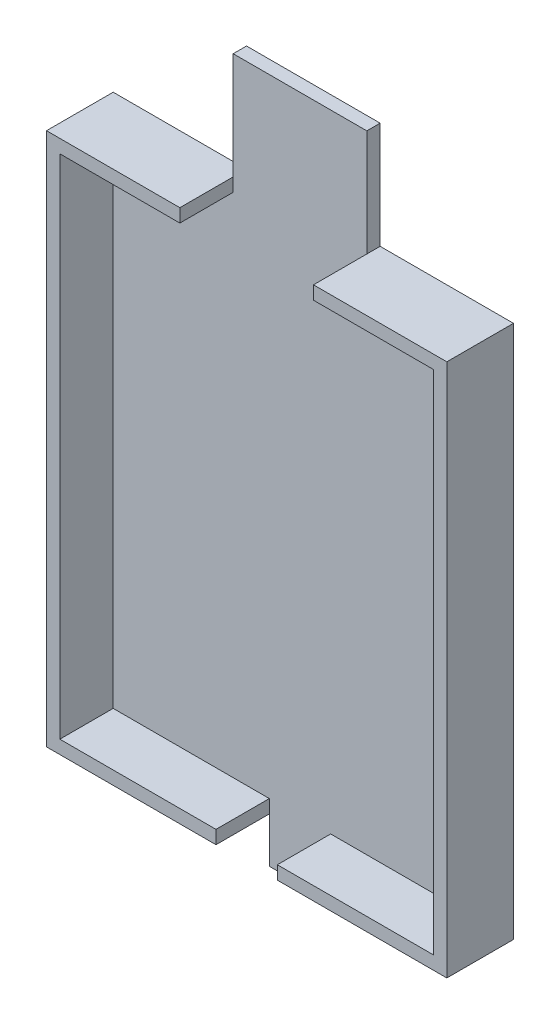
ISO-10303-21;
HEADER;
FILE_DESCRIPTION(('STEP AP214'),'2;1');
FILE_NAME('part.step','',(''),(''),'','','');
FILE_SCHEMA(('AUTOMOTIVE_DESIGN { 1 0 10303 214 1 1 1 1 }'));
ENDSEC;
DATA;
#1=APPLICATION_CONTEXT('core data for automotive mechanical design processes');
#2=APPLICATION_PROTOCOL_DEFINITION('international standard','automotive_design',2000,#1);
#3=PRODUCT_CONTEXT('',#1,'mechanical');
#4=PRODUCT('Part','Part','',(#3));
#5=PRODUCT_RELATED_PRODUCT_CATEGORY('part','',(#4));
#6=PRODUCT_DEFINITION_FORMATION('','',#4);
#7=PRODUCT_DEFINITION_CONTEXT('part definition',#1,'design');
#8=PRODUCT_DEFINITION('design','',#6,#7);
#9=PRODUCT_DEFINITION_SHAPE('','',#8);
#10=(LENGTH_UNIT() NAMED_UNIT(*) SI_UNIT(.MILLI.,.METRE.));
#11=(NAMED_UNIT(*) PLANE_ANGLE_UNIT() SI_UNIT($,.RADIAN.));
#12=(NAMED_UNIT(*) SI_UNIT($,.STERADIAN.) SOLID_ANGLE_UNIT());
#13=UNCERTAINTY_MEASURE_WITH_UNIT(LENGTH_MEASURE(1.E-05),#10,'distance_accuracy_value','');
#14=(GEOMETRIC_REPRESENTATION_CONTEXT(3) GLOBAL_UNCERTAINTY_ASSIGNED_CONTEXT((#13)) GLOBAL_UNIT_ASSIGNED_CONTEXT((#10,
#11,#12)) REPRESENTATION_CONTEXT('',''));
#15=CARTESIAN_POINT('',(0.,0.,0.));
#16=DIRECTION('',(0.,0.,1.));
#17=DIRECTION('',(1.,0.,0.));
#18=AXIS2_PLACEMENT_3D('',#15,#16,#17);
#19=CARTESIAN_POINT('',(0.,0.,5.));
#20=DIRECTION('',(0.,0.,1.));
#21=DIRECTION('',(1.,0.,0.));
#22=AXIS2_PLACEMENT_3D('',#19,#20,#21);
#23=PLANE('',#22);
#24=DIRECTION('',(1.,0.,0.));
#25=VECTOR('',#24,1.);
#26=CARTESIAN_POINT('',(71.8364077669903,146.449514563107,5.));
#27=LINE('',#26,#25);
#28=CARTESIAN_POINT('',(26.8364077669903,146.449514563107,5.));
#29=VERTEX_POINT('',#28);
#30=CARTESIAN_POINT('',(71.8364077669903,146.449514563107,5.));
#31=VERTEX_POINT('',#30);
#32=EDGE_CURVE('E61',#29,#31,#27,.T.);
#33=ORIENTED_EDGE('',*,*,#32,.F.);
#34=DIRECTION('',(0.,-1.,0.));
#35=VECTOR('',#34,1.);
#36=CARTESIAN_POINT('',(26.8364077669903,146.449514563107,5.));
#37=LINE('',#36,#35);
#38=CARTESIAN_POINT('',(26.8364077669903,151.449514563107,5.));
#39=VERTEX_POINT('',#38);
#40=EDGE_CURVE('E219',#39,#29,#37,.T.);
#41=ORIENTED_EDGE('',*,*,#40,.F.);
#42=DIRECTION('',(0.,1.,0.));
#43=VECTOR('',#42,1.);
#44=CARTESIAN_POINT('',(26.8364077669902,191.449514563107,5.));
#45=LINE('',#44,#43);
#46=CARTESIAN_POINT('',(26.8364077669902,191.449514563107,5.));
#47=VERTEX_POINT('',#46);
#48=EDGE_CURVE('E310',#39,#47,#45,.T.);
#49=ORIENTED_EDGE('',*,*,#48,.T.);
#50=DIRECTION('',(-1.,0.,0.));
#51=VECTOR('',#50,1.);
#52=CARTESIAN_POINT('',(-23.2635922330097,191.449514563107,5.));
#53=LINE('',#52,#51);
#54=CARTESIAN_POINT('',(-23.2635922330097,191.449514563107,5.));
#55=VERTEX_POINT('',#54);
#56=EDGE_CURVE('E313',#47,#55,#53,.T.);
#57=ORIENTED_EDGE('',*,*,#56,.T.);
#58=DIRECTION('',(0.,-1.,0.));
#59=VECTOR('',#58,1.);
#60=CARTESIAN_POINT('',(-23.2635922330097,151.449514563107,5.));
#61=LINE('',#60,#59);
#62=CARTESIAN_POINT('',(-23.2635922330097,151.449514563107,5.));
#63=VERTEX_POINT('',#62);
#64=EDGE_CURVE('E316',#55,#63,#61,.T.);
#65=ORIENTED_EDGE('',*,*,#64,.T.);
#66=DIRECTION('',(0.,1.,0.));
#67=VECTOR('',#66,1.);
#68=CARTESIAN_POINT('',(-23.2635922330097,146.449514563107,5.));
#69=LINE('',#68,#67);
#70=CARTESIAN_POINT('',(-23.2635922330097,146.449514563107,5.));
#71=VERTEX_POINT('',#70);
#72=EDGE_CURVE('E221',#71,#63,#69,.T.);
#73=ORIENTED_EDGE('',*,*,#72,.F.);
#74=DIRECTION('',(1.,0.,0.));
#75=VECTOR('',#74,1.);
#76=CARTESIAN_POINT('',(-68.2635922330097,146.449514563107,5.));
#77=LINE('',#76,#75);
#78=CARTESIAN_POINT('',(-68.2635922330097,146.449514563107,5.));
#79=VERTEX_POINT('',#78);
#80=EDGE_CURVE('E237',#79,#71,#77,.T.);
#81=ORIENTED_EDGE('',*,*,#80,.F.);
#82=DIRECTION('',(0.,1.,0.));
#83=VECTOR('',#82,1.);
#84=CARTESIAN_POINT('',(-68.2635922330097,-43.6504854368932,5.));
#85=LINE('',#84,#83);
#86=CARTESIAN_POINT('',(-68.2635922330097,-43.6504854368932,5.));
#87=VERTEX_POINT('',#86);
#88=EDGE_CURVE('E268',#87,#79,#85,.T.);
#89=ORIENTED_EDGE('',*,*,#88,.F.);
#90=DIRECTION('',(-1.,0.,0.));
#91=VECTOR('',#90,1.);
#92=CARTESIAN_POINT('',(-9.71359223300971,-43.6504854368932,5.));
#93=LINE('',#92,#91);
#94=CARTESIAN_POINT('',(-9.71359223300971,-43.6504854368932,5.));
#95=VERTEX_POINT('',#94);
#96=EDGE_CURVE('E264',#95,#87,#93,.T.);
#97=ORIENTED_EDGE('',*,*,#96,.F.);
#98=DIRECTION('',(0.,1.,0.));
#99=VECTOR('',#98,1.);
#100=CARTESIAN_POINT('',(-9.71359223300971,-48.6504854368932,5.));
#101=LINE('',#100,#99);
#102=CARTESIAN_POINT('',(-9.71359223300971,-48.6504854368932,5.));
#103=VERTEX_POINT('',#102);
#104=EDGE_CURVE('E226',#103,#95,#101,.T.);
#105=ORIENTED_EDGE('',*,*,#104,.F.);
#106=DIRECTION('',(0.,-1.,0.));
#107=VECTOR('',#106,1.);
#108=CARTESIAN_POINT('',(-9.71359223300971,-48.6504854368932,5.));
#109=LINE('',#108,#107);
#110=CARTESIAN_POINT('',(-9.71359223300971,-65.6504854368931,5.));
#111=VERTEX_POINT('',#110);
#112=EDGE_CURVE('E299',#103,#111,#109,.T.);
#113=ORIENTED_EDGE('',*,*,#112,.T.);
#114=DIRECTION('',(1.,0.,0.));
#115=VECTOR('',#114,1.);
#116=CARTESIAN_POINT('',(-9.71359223300971,-65.6504854368931,5.));
#117=LINE('',#116,#115);
#118=CARTESIAN_POINT('',(13.2864077669903,-65.6504854368931,5.));
#119=VERTEX_POINT('',#118);
#120=EDGE_CURVE('E303',#111,#119,#117,.T.);
#121=ORIENTED_EDGE('',*,*,#120,.T.);
#122=DIRECTION('',(0.,1.,0.));
#123=VECTOR('',#122,1.);
#124=CARTESIAN_POINT('',(13.2864077669903,-65.6504854368931,5.));
#125=LINE('',#124,#123);
#126=CARTESIAN_POINT('',(13.2864077669903,-48.6504854368932,5.));
#127=VERTEX_POINT('',#126);
#128=EDGE_CURVE('E307',#119,#127,#125,.T.);
#129=ORIENTED_EDGE('',*,*,#128,.T.);
#130=DIRECTION('',(0.,-1.,0.));
#131=VECTOR('',#130,1.);
#132=CARTESIAN_POINT('',(13.2864077669903,-48.6504854368932,5.));
#133=LINE('',#132,#131);
#134=CARTESIAN_POINT('',(13.2864077669903,-43.6504854368932,5.));
#135=VERTEX_POINT('',#134);
#136=EDGE_CURVE('E216',#135,#127,#133,.T.);
#137=ORIENTED_EDGE('',*,*,#136,.F.);
#138=DIRECTION('',(-1.,0.,0.));
#139=VECTOR('',#138,1.);
#140=CARTESIAN_POINT('',(13.2864077669903,-43.6504854368932,5.));
#141=LINE('',#140,#139);
#142=CARTESIAN_POINT('',(71.8364077669903,-43.6504854368932,5.));
#143=VERTEX_POINT('',#142);
#144=EDGE_CURVE('E434',#143,#135,#141,.T.);
#145=ORIENTED_EDGE('',*,*,#144,.F.);
#146=DIRECTION('',(0.,-1.,0.));
#147=VECTOR('',#146,1.);
#148=CARTESIAN_POINT('',(71.8364077669903,-43.6504854368932,5.));
#149=LINE('',#148,#147);
#150=EDGE_CURVE('E66',#31,#143,#149,.T.);
#151=ORIENTED_EDGE('',*,*,#150,.F.);
#152=EDGE_LOOP('',(#33,#41,#49,#57,#65,#73,#81,#89,#97,#105,#113,#121,#129,#137,#145,#151));
#153=FACE_BOUND('',#152,.T.);
#154=ADVANCED_FACE('F45',(#153),#23,.T.);
#155=CARTESIAN_POINT('',(-9.71359223300971,-48.6504854368932,5.));
#156=DIRECTION('',(1.,0.,0.));
#157=DIRECTION('',(0.,1.,0.));
#158=AXIS2_PLACEMENT_3D('',#155,#156,#157);
#159=PLANE('',#158);
#160=DIRECTION('',(0.,-1.,0.));
#161=VECTOR('',#160,1.);
#162=CARTESIAN_POINT('',(-9.71359223300971,-48.6504854368932,0.));
#163=LINE('',#162,#161);
#164=CARTESIAN_POINT('',(-9.71359223300971,-48.6504854368932,0.));
#165=VERTEX_POINT('',#164);
#166=CARTESIAN_POINT('',(-9.71359223300971,-65.6504854368931,0.));
#167=VERTEX_POINT('',#166);
#168=EDGE_CURVE('E298',#165,#167,#163,.T.);
#169=ORIENTED_EDGE('',*,*,#168,.T.);
#170=DIRECTION('',(0.,0.,-1.));
#171=VECTOR('',#170,1.);
#172=CARTESIAN_POINT('',(-9.71359223300971,-65.6504854368931,5.));
#173=LINE('',#172,#171);
#174=EDGE_CURVE('E11',#111,#167,#173,.T.);
#175=ORIENTED_EDGE('',*,*,#174,.F.);
#176=ORIENTED_EDGE('',*,*,#112,.F.);
#177=DIRECTION('',(0.,0.,-1.));
#178=VECTOR('',#177,1.);
#179=CARTESIAN_POINT('',(-9.71359223300971,-48.6504854368932,5.));
#180=LINE('',#179,#178);
#181=EDGE_CURVE('E319',#103,#165,#180,.T.);
#182=ORIENTED_EDGE('',*,*,#181,.T.);
#183=EDGE_LOOP('',(#169,#175,#176,#182));
#184=FACE_BOUND('',#183,.T.);
#185=ADVANCED_FACE('F47',(#184),#159,.F.);
#186=CARTESIAN_POINT('',(-9.71359223300971,-65.6504854368931,5.));
#187=DIRECTION('',(0.,1.,0.));
#188=DIRECTION('',(0.,0.,1.));
#189=AXIS2_PLACEMENT_3D('',#186,#187,#188);
#190=PLANE('',#189);
#191=DIRECTION('',(1.,0.,0.));
#192=VECTOR('',#191,1.);
#193=CARTESIAN_POINT('',(-9.71359223300971,-65.6504854368931,0.));
#194=LINE('',#193,#192);
#195=CARTESIAN_POINT('',(13.2864077669903,-65.6504854368931,0.));
#196=VERTEX_POINT('',#195);
#197=EDGE_CURVE('E323',#167,#196,#194,.T.);
#198=ORIENTED_EDGE('',*,*,#197,.T.);
#199=DIRECTION('',(0.,0.,-1.));
#200=VECTOR('',#199,1.);
#201=CARTESIAN_POINT('',(13.2864077669903,-65.6504854368931,5.));
#202=LINE('',#201,#200);
#203=EDGE_CURVE('E54',#119,#196,#202,.T.);
#204=ORIENTED_EDGE('',*,*,#203,.F.);
#205=ORIENTED_EDGE('',*,*,#120,.F.);
#206=ORIENTED_EDGE('',*,*,#174,.T.);
#207=EDGE_LOOP('',(#198,#204,#205,#206));
#208=FACE_BOUND('',#207,.T.);
#209=ADVANCED_FACE('F470',(#208),#190,.F.);
#210=CARTESIAN_POINT('',(13.2864077669903,-65.6504854368931,5.));
#211=DIRECTION('',(-1.,0.,0.));
#212=DIRECTION('',(0.,0.,1.));
#213=AXIS2_PLACEMENT_3D('',#210,#211,#212);
#214=PLANE('',#213);
#215=DIRECTION('',(0.,1.,0.));
#216=VECTOR('',#215,1.);
#217=CARTESIAN_POINT('',(13.2864077669903,-65.6504854368931,0.));
#218=LINE('',#217,#216);
#219=CARTESIAN_POINT('',(13.2864077669903,-48.6504854368932,0.));
#220=VERTEX_POINT('',#219);
#221=EDGE_CURVE('E326',#196,#220,#218,.T.);
#222=ORIENTED_EDGE('',*,*,#221,.T.);
#223=DIRECTION('',(0.,0.,-1.));
#224=VECTOR('',#223,1.);
#225=CARTESIAN_POINT('',(13.2864077669903,-48.6504854368932,5.));
#226=LINE('',#225,#224);
#227=EDGE_CURVE('E390',#127,#220,#226,.T.);
#228=ORIENTED_EDGE('',*,*,#227,.F.);
#229=ORIENTED_EDGE('',*,*,#128,.F.);
#230=ORIENTED_EDGE('',*,*,#203,.T.);
#231=EDGE_LOOP('',(#222,#228,#229,#230));
#232=FACE_BOUND('',#231,.T.);
#233=ADVANCED_FACE('F399',(#232),#214,.F.);
#234=CARTESIAN_POINT('',(13.2864077669903,-48.6504854368932,5.));
#235=DIRECTION('',(0.,1.,0.));
#236=DIRECTION('',(0.,0.,1.));
#237=AXIS2_PLACEMENT_3D('',#234,#235,#236);
#238=PLANE('',#237);
#239=DIRECTION('',(1.,0.,0.));
#240=VECTOR('',#239,1.);
#241=CARTESIAN_POINT('',(13.2864077669903,-48.6504854368932,0.));
#242=LINE('',#241,#240);
#243=CARTESIAN_POINT('',(76.8364077669903,-48.6504854368932,0.));
#244=VERTEX_POINT('',#243);
#245=EDGE_CURVE('E329',#220,#244,#242,.T.);
#246=ORIENTED_EDGE('',*,*,#245,.T.);
#247=DIRECTION('',(0.,0.,-1.));
#248=VECTOR('',#247,1.);
#249=CARTESIAN_POINT('',(76.8364077669903,-48.6504854368932,5.));
#250=LINE('',#249,#248);
#251=CARTESIAN_POINT('',(76.8364077669903,-48.6504854368932,25.));
#252=VERTEX_POINT('',#251);
#253=EDGE_CURVE('E386',#252,#244,#250,.T.);
#254=ORIENTED_EDGE('',*,*,#253,.F.);
#255=DIRECTION('',(1.,0.,0.));
#256=VECTOR('',#255,1.);
#257=CARTESIAN_POINT('',(76.8364077669903,-48.6504854368932,25.));
#258=LINE('',#257,#256);
#259=CARTESIAN_POINT('',(13.2864077669903,-48.6504854368932,25.));
#260=VERTEX_POINT('',#259);
#261=EDGE_CURVE('E418',#260,#252,#258,.T.);
#262=ORIENTED_EDGE('',*,*,#261,.F.);
#263=DIRECTION('',(0.,0.,-1.));
#264=VECTOR('',#263,1.);
#265=CARTESIAN_POINT('',(13.2864077669903,-48.6504854368932,25.));
#266=LINE('',#265,#264);
#267=EDGE_CURVE('E443',#260,#127,#266,.T.);
#268=ORIENTED_EDGE('',*,*,#267,.T.);
#269=ORIENTED_EDGE('',*,*,#227,.T.);
#270=EDGE_LOOP('',(#246,#254,#262,#268,#269));
#271=FACE_BOUND('',#270,.T.);
#272=ADVANCED_FACE('F409',(#271),#238,.F.);
#273=CARTESIAN_POINT('',(76.8364077669903,-48.6504854368932,5.));
#274=DIRECTION('',(-1.,0.,0.));
#275=DIRECTION('',(0.,-1.,0.));
#276=AXIS2_PLACEMENT_3D('',#273,#274,#275);
#277=PLANE('',#276);
#278=DIRECTION('',(0.,1.,0.));
#279=VECTOR('',#278,1.);
#280=CARTESIAN_POINT('',(76.8364077669903,-48.6504854368932,0.));
#281=LINE('',#280,#279);
#282=CARTESIAN_POINT('',(76.8364077669903,151.449514563107,0.));
#283=VERTEX_POINT('',#282);
#284=EDGE_CURVE('E332',#244,#283,#281,.T.);
#285=ORIENTED_EDGE('',*,*,#284,.T.);
#286=DIRECTION('',(0.,0.,-1.));
#287=VECTOR('',#286,1.);
#288=CARTESIAN_POINT('',(76.8364077669903,151.449514563107,5.));
#289=LINE('',#288,#287);
#290=CARTESIAN_POINT('',(76.8364077669903,151.449514563107,25.));
#291=VERTEX_POINT('',#290);
#292=EDGE_CURVE('E382',#291,#283,#289,.T.);
#293=ORIENTED_EDGE('',*,*,#292,.F.);
#294=DIRECTION('',(0.,1.,0.));
#295=VECTOR('',#294,1.);
#296=CARTESIAN_POINT('',(76.8364077669903,151.449514563107,25.));
#297=LINE('',#296,#295);
#298=EDGE_CURVE('E416',#252,#291,#297,.T.);
#299=ORIENTED_EDGE('',*,*,#298,.F.);
#300=ORIENTED_EDGE('',*,*,#253,.T.);
#301=EDGE_LOOP('',(#285,#293,#299,#300));
#302=FACE_BOUND('',#301,.T.);
#303=ADVANCED_FACE('F415',(#302),#277,.F.);
#304=CARTESIAN_POINT('',(26.8364077669903,151.449514563107,5.));
#305=DIRECTION('',(0.,-1.,0.));
#306=DIRECTION('',(0.,0.,-1.));
#307=AXIS2_PLACEMENT_3D('',#304,#305,#306);
#308=PLANE('',#307);
#309=DIRECTION('',(-1.,0.,0.));
#310=VECTOR('',#309,1.);
#311=CARTESIAN_POINT('',(26.8364077669903,151.449514563107,0.));
#312=LINE('',#311,#310);
#313=CARTESIAN_POINT('',(26.8364077669903,151.449514563107,0.));
#314=VERTEX_POINT('',#313);
#315=EDGE_CURVE('E335',#283,#314,#312,.T.);
#316=ORIENTED_EDGE('',*,*,#315,.T.);
#317=DIRECTION('',(0.,0.,-1.));
#318=VECTOR('',#317,1.);
#319=CARTESIAN_POINT('',(26.8364077669903,151.449514563107,5.));
#320=LINE('',#319,#318);
#321=EDGE_CURVE('E378',#39,#314,#320,.T.);
#322=ORIENTED_EDGE('',*,*,#321,.F.);
#323=DIRECTION('',(0.,0.,-1.));
#324=VECTOR('',#323,1.);
#325=CARTESIAN_POINT('',(26.8364077669903,151.449514563107,25.));
#326=LINE('',#325,#324);
#327=CARTESIAN_POINT('',(26.8364077669903,151.449514563107,25.));
#328=VERTEX_POINT('',#327);
#329=EDGE_CURVE('E422',#328,#39,#326,.T.);
#330=ORIENTED_EDGE('',*,*,#329,.F.);
#331=DIRECTION('',(-1.,0.,0.));
#332=VECTOR('',#331,1.);
#333=CARTESIAN_POINT('',(26.8364077669903,151.449514563107,25.));
#334=LINE('',#333,#332);
#335=EDGE_CURVE('E211',#291,#328,#334,.T.);
#336=ORIENTED_EDGE('',*,*,#335,.F.);
#337=ORIENTED_EDGE('',*,*,#292,.T.);
#338=EDGE_LOOP('',(#316,#322,#330,#336,#337));
#339=FACE_BOUND('',#338,.T.);
#340=ADVANCED_FACE('F505',(#339),#308,.F.);
#341=CARTESIAN_POINT('',(26.8364077669902,191.449514563107,5.));
#342=DIRECTION('',(-1.,0.,0.));
#343=DIRECTION('',(0.,-1.,0.));
#344=AXIS2_PLACEMENT_3D('',#341,#342,#343);
#345=PLANE('',#344);
#346=DIRECTION('',(0.,1.,0.));
#347=VECTOR('',#346,1.);
#348=CARTESIAN_POINT('',(26.8364077669902,191.449514563107,0.));
#349=LINE('',#348,#347);
#350=CARTESIAN_POINT('',(26.8364077669902,191.449514563107,0.));
#351=VERTEX_POINT('',#350);
#352=EDGE_CURVE('E338',#314,#351,#349,.T.);
#353=ORIENTED_EDGE('',*,*,#352,.T.);
#354=DIRECTION('',(0.,0.,-1.));
#355=VECTOR('',#354,1.);
#356=CARTESIAN_POINT('',(26.8364077669902,191.449514563107,5.));
#357=LINE('',#356,#355);
#358=EDGE_CURVE('E374',#47,#351,#357,.T.);
#359=ORIENTED_EDGE('',*,*,#358,.F.);
#360=ORIENTED_EDGE('',*,*,#48,.F.);
#361=ORIENTED_EDGE('',*,*,#321,.T.);
#362=EDGE_LOOP('',(#353,#359,#360,#361));
#363=FACE_BOUND('',#362,.T.);
#364=ADVANCED_FACE('F502',(#363),#345,.F.);
#365=CARTESIAN_POINT('',(-23.2635922330097,191.449514563107,5.));
#366=DIRECTION('',(0.,-1.,0.));
#367=DIRECTION('',(0.,0.,-1.));
#368=AXIS2_PLACEMENT_3D('',#365,#366,#367);
#369=PLANE('',#368);
#370=DIRECTION('',(-1.,0.,0.));
#371=VECTOR('',#370,1.);
#372=CARTESIAN_POINT('',(-23.2635922330097,191.449514563107,0.));
#373=LINE('',#372,#371);
#374=CARTESIAN_POINT('',(-23.2635922330097,191.449514563107,0.));
#375=VERTEX_POINT('',#374);
#376=EDGE_CURVE('E341',#351,#375,#373,.T.);
#377=ORIENTED_EDGE('',*,*,#376,.T.);
#378=DIRECTION('',(0.,0.,-1.));
#379=VECTOR('',#378,1.);
#380=CARTESIAN_POINT('',(-23.2635922330097,191.449514563107,5.));
#381=LINE('',#380,#379);
#382=EDGE_CURVE('E370',#55,#375,#381,.T.);
#383=ORIENTED_EDGE('',*,*,#382,.F.);
#384=ORIENTED_EDGE('',*,*,#56,.F.);
#385=ORIENTED_EDGE('',*,*,#358,.T.);
#386=EDGE_LOOP('',(#377,#383,#384,#385));
#387=FACE_BOUND('',#386,.T.);
#388=ADVANCED_FACE('F499',(#387),#369,.F.);
#389=CARTESIAN_POINT('',(-23.2635922330097,151.449514563107,5.));
#390=DIRECTION('',(1.,0.,0.));
#391=DIRECTION('',(0.,0.,-1.));
#392=AXIS2_PLACEMENT_3D('',#389,#390,#391);
#393=PLANE('',#392);
#394=DIRECTION('',(0.,-1.,0.));
#395=VECTOR('',#394,1.);
#396=CARTESIAN_POINT('',(-23.2635922330097,151.449514563107,0.));
#397=LINE('',#396,#395);
#398=CARTESIAN_POINT('',(-23.2635922330097,151.449514563107,0.));
#399=VERTEX_POINT('',#398);
#400=EDGE_CURVE('E344',#375,#399,#397,.T.);
#401=ORIENTED_EDGE('',*,*,#400,.T.);
#402=DIRECTION('',(0.,0.,-1.));
#403=VECTOR('',#402,1.);
#404=CARTESIAN_POINT('',(-23.2635922330097,151.449514563107,5.));
#405=LINE('',#404,#403);
#406=EDGE_CURVE('E366',#63,#399,#405,.T.);
#407=ORIENTED_EDGE('',*,*,#406,.F.);
#408=ORIENTED_EDGE('',*,*,#64,.F.);
#409=ORIENTED_EDGE('',*,*,#382,.T.);
#410=EDGE_LOOP('',(#401,#407,#408,#409));
#411=FACE_BOUND('',#410,.T.);
#412=ADVANCED_FACE('F494',(#411),#393,.F.);
#413=CARTESIAN_POINT('',(-73.2635922330097,151.449514563107,5.));
#414=DIRECTION('',(0.,-1.,0.));
#415=DIRECTION('',(1.,0.,0.));
#416=AXIS2_PLACEMENT_3D('',#413,#414,#415);
#417=PLANE('',#416);
#418=DIRECTION('',(-1.,0.,0.));
#419=VECTOR('',#418,1.);
#420=CARTESIAN_POINT('',(-73.2635922330097,151.449514563107,0.));
#421=LINE('',#420,#419);
#422=CARTESIAN_POINT('',(-73.2635922330097,151.449514563107,0.));
#423=VERTEX_POINT('',#422);
#424=EDGE_CURVE('E347',#399,#423,#421,.T.);
#425=ORIENTED_EDGE('',*,*,#424,.T.);
#426=DIRECTION('',(0.,0.,-1.));
#427=VECTOR('',#426,1.);
#428=CARTESIAN_POINT('',(-73.2635922330097,151.449514563107,5.));
#429=LINE('',#428,#427);
#430=CARTESIAN_POINT('',(-73.2635922330097,151.449514563107,25.));
#431=VERTEX_POINT('',#430);
#432=EDGE_CURVE('E362',#431,#423,#429,.T.);
#433=ORIENTED_EDGE('',*,*,#432,.F.);
#434=DIRECTION('',(-1.,0.,0.));
#435=VECTOR('',#434,1.);
#436=CARTESIAN_POINT('',(-23.2635922330097,151.449514563107,25.));
#437=LINE('',#436,#435);
#438=CARTESIAN_POINT('',(-23.2635922330097,151.449514563107,25.));
#439=VERTEX_POINT('',#438);
#440=EDGE_CURVE('E236',#439,#431,#437,.T.);
#441=ORIENTED_EDGE('',*,*,#440,.F.);
#442=DIRECTION('',(0.,0.,-1.));
#443=VECTOR('',#442,1.);
#444=CARTESIAN_POINT('',(-23.2635922330097,151.449514563107,25.));
#445=LINE('',#444,#443);
#446=EDGE_CURVE('E294',#439,#63,#445,.T.);
#447=ORIENTED_EDGE('',*,*,#446,.T.);
#448=ORIENTED_EDGE('',*,*,#406,.T.);
#449=EDGE_LOOP('',(#425,#433,#441,#447,#448));
#450=FACE_BOUND('',#449,.T.);
#451=ADVANCED_FACE('F488',(#450),#417,.F.);
#452=CARTESIAN_POINT('',(-73.2635922330097,151.449514563107,5.));
#453=DIRECTION('',(1.,0.,0.));
#454=DIRECTION('',(0.,1.,0.));
#455=AXIS2_PLACEMENT_3D('',#452,#453,#454);
#456=PLANE('',#455);
#457=DIRECTION('',(0.,-1.,0.));
#458=VECTOR('',#457,1.);
#459=CARTESIAN_POINT('',(-73.2635922330097,151.449514563107,0.));
#460=LINE('',#459,#458);
#461=CARTESIAN_POINT('',(-73.2635922330097,-48.6504854368932,0.));
#462=VERTEX_POINT('',#461);
#463=EDGE_CURVE('E350',#423,#462,#460,.T.);
#464=ORIENTED_EDGE('',*,*,#463,.T.);
#465=DIRECTION('',(0.,0.,-1.));
#466=VECTOR('',#465,1.);
#467=CARTESIAN_POINT('',(-73.2635922330097,-48.6504854368932,5.));
#468=LINE('',#467,#466);
#469=CARTESIAN_POINT('',(-73.2635922330097,-48.6504854368932,25.));
#470=VERTEX_POINT('',#469);
#471=EDGE_CURVE('E358',#470,#462,#468,.T.);
#472=ORIENTED_EDGE('',*,*,#471,.F.);
#473=DIRECTION('',(0.,-1.,0.));
#474=VECTOR('',#473,1.);
#475=CARTESIAN_POINT('',(-73.2635922330097,151.449514563107,25.));
#476=LINE('',#475,#474);
#477=EDGE_CURVE('E241',#431,#470,#476,.T.);
#478=ORIENTED_EDGE('',*,*,#477,.F.);
#479=ORIENTED_EDGE('',*,*,#432,.T.);
#480=EDGE_LOOP('',(#464,#472,#478,#479));
#481=FACE_BOUND('',#480,.T.);
#482=ADVANCED_FACE('F482',(#481),#456,.F.);
#483=CARTESIAN_POINT('',(-73.2635922330097,-48.6504854368932,5.));
#484=DIRECTION('',(0.,1.,0.));
#485=DIRECTION('',(-1.,0.,0.));
#486=AXIS2_PLACEMENT_3D('',#483,#484,#485);
#487=PLANE('',#486);
#488=DIRECTION('',(1.,0.,0.));
#489=VECTOR('',#488,1.);
#490=CARTESIAN_POINT('',(-73.2635922330097,-48.6504854368932,0.));
#491=LINE('',#490,#489);
#492=EDGE_CURVE('E304',#462,#165,#491,.T.);
#493=ORIENTED_EDGE('',*,*,#492,.T.);
#494=ORIENTED_EDGE('',*,*,#181,.F.);
#495=DIRECTION('',(0.,0.,-1.));
#496=VECTOR('',#495,1.);
#497=CARTESIAN_POINT('',(-9.71359223300971,-48.6504854368932,25.));
#498=LINE('',#497,#496);
#499=CARTESIAN_POINT('',(-9.71359223300971,-48.6504854368932,25.));
#500=VERTEX_POINT('',#499);
#501=EDGE_CURVE('E290',#500,#103,#498,.T.);
#502=ORIENTED_EDGE('',*,*,#501,.F.);
#503=DIRECTION('',(1.,0.,0.));
#504=VECTOR('',#503,1.);
#505=CARTESIAN_POINT('',(-73.2635922330097,-48.6504854368932,25.));
#506=LINE('',#505,#504);
#507=EDGE_CURVE('E245',#470,#500,#506,.T.);
#508=ORIENTED_EDGE('',*,*,#507,.F.);
#509=ORIENTED_EDGE('',*,*,#471,.T.);
#510=EDGE_LOOP('',(#493,#494,#502,#508,#509));
#511=FACE_BOUND('',#510,.T.);
#512=ADVANCED_FACE('F477',(#511),#487,.F.);
#513=CARTESIAN_POINT('',(0.,0.,0.));
#514=DIRECTION('',(0.,0.,1.));
#515=DIRECTION('',(1.,0.,0.));
#516=AXIS2_PLACEMENT_3D('',#513,#514,#515);
#517=PLANE('',#516);
#518=ORIENTED_EDGE('',*,*,#168,.F.);
#519=ORIENTED_EDGE('',*,*,#492,.F.);
#520=ORIENTED_EDGE('',*,*,#463,.F.);
#521=ORIENTED_EDGE('',*,*,#424,.F.);
#522=ORIENTED_EDGE('',*,*,#400,.F.);
#523=ORIENTED_EDGE('',*,*,#376,.F.);
#524=ORIENTED_EDGE('',*,*,#352,.F.);
#525=ORIENTED_EDGE('',*,*,#315,.F.);
#526=ORIENTED_EDGE('',*,*,#284,.F.);
#527=ORIENTED_EDGE('',*,*,#245,.F.);
#528=ORIENTED_EDGE('',*,*,#221,.F.);
#529=ORIENTED_EDGE('',*,*,#197,.F.);
#530=EDGE_LOOP('',(#518,#519,#520,#521,#522,#523,#524,#525,#526,#527,#528,#529));
#531=FACE_BOUND('',#530,.T.);
#532=ADVANCED_FACE('F405',(#531),#517,.F.);
#533=CARTESIAN_POINT('',(-23.2635922330097,146.449514563107,25.));
#534=DIRECTION('',(-1.,0.,0.));
#535=DIRECTION('',(0.,0.,1.));
#536=AXIS2_PLACEMENT_3D('',#533,#534,#535);
#537=PLANE('',#536);
#538=ORIENTED_EDGE('',*,*,#72,.T.);
#539=ORIENTED_EDGE('',*,*,#446,.F.);
#540=DIRECTION('',(0.,1.,0.));
#541=VECTOR('',#540,1.);
#542=CARTESIAN_POINT('',(-23.2635922330097,146.449514563107,25.));
#543=LINE('',#542,#541);
#544=CARTESIAN_POINT('',(-23.2635922330097,146.449514563107,25.));
#545=VERTEX_POINT('',#544);
#546=EDGE_CURVE('E232',#545,#439,#543,.T.);
#547=ORIENTED_EDGE('',*,*,#546,.F.);
#548=DIRECTION('',(0.,0.,-1.));
#549=VECTOR('',#548,1.);
#550=CARTESIAN_POINT('',(-23.2635922330097,146.449514563107,25.));
#551=LINE('',#550,#549);
#552=EDGE_CURVE('E259',#545,#71,#551,.T.);
#553=ORIENTED_EDGE('',*,*,#552,.T.);
#554=EDGE_LOOP('',(#538,#539,#547,#553));
#555=FACE_BOUND('',#554,.T.);
#556=ADVANCED_FACE('F512',(#555),#537,.F.);
#557=CARTESIAN_POINT('',(-9.71359223300971,-48.6504854368932,25.));
#558=DIRECTION('',(-1.,0.,0.));
#559=DIRECTION('',(0.,0.,1.));
#560=AXIS2_PLACEMENT_3D('',#557,#558,#559);
#561=PLANE('',#560);
#562=ORIENTED_EDGE('',*,*,#104,.T.);
#563=DIRECTION('',(0.,0.,-1.));
#564=VECTOR('',#563,1.);
#565=CARTESIAN_POINT('',(-9.71359223300971,-43.6504854368932,25.));
#566=LINE('',#565,#564);
#567=CARTESIAN_POINT('',(-9.71359223300971,-43.6504854368932,25.));
#568=VERTEX_POINT('',#567);
#569=EDGE_CURVE('E286',#568,#95,#566,.T.);
#570=ORIENTED_EDGE('',*,*,#569,.F.);
#571=DIRECTION('',(0.,1.,0.));
#572=VECTOR('',#571,1.);
#573=CARTESIAN_POINT('',(-9.71359223300971,-48.6504854368932,25.));
#574=LINE('',#573,#572);
#575=EDGE_CURVE('E248',#500,#568,#574,.T.);
#576=ORIENTED_EDGE('',*,*,#575,.F.);
#577=ORIENTED_EDGE('',*,*,#501,.T.);
#578=EDGE_LOOP('',(#562,#570,#576,#577));
#579=FACE_BOUND('',#578,.T.);
#580=ADVANCED_FACE('F514',(#579),#561,.F.);
#581=CARTESIAN_POINT('',(-9.71359223300971,-43.6504854368932,25.));
#582=DIRECTION('',(0.,-1.,0.));
#583=DIRECTION('',(1.,0.,0.));
#584=AXIS2_PLACEMENT_3D('',#581,#582,#583);
#585=PLANE('',#584);
#586=ORIENTED_EDGE('',*,*,#96,.T.);
#587=DIRECTION('',(0.,0.,-1.));
#588=VECTOR('',#587,1.);
#589=CARTESIAN_POINT('',(-68.2635922330097,-43.6504854368932,25.));
#590=LINE('',#589,#588);
#591=CARTESIAN_POINT('',(-68.2635922330097,-43.6504854368932,25.));
#592=VERTEX_POINT('',#591);
#593=EDGE_CURVE('E282',#592,#87,#590,.T.);
#594=ORIENTED_EDGE('',*,*,#593,.F.);
#595=DIRECTION('',(-1.,0.,0.));
#596=VECTOR('',#595,1.);
#597=CARTESIAN_POINT('',(-9.71359223300971,-43.6504854368932,25.));
#598=LINE('',#597,#596);
#599=EDGE_CURVE('E251',#568,#592,#598,.T.);
#600=ORIENTED_EDGE('',*,*,#599,.F.);
#601=ORIENTED_EDGE('',*,*,#569,.T.);
#602=EDGE_LOOP('',(#586,#594,#600,#601));
#603=FACE_BOUND('',#602,.T.);
#604=ADVANCED_FACE('F520',(#603),#585,.F.);
#605=CARTESIAN_POINT('',(-68.2635922330097,-43.6504854368932,25.));
#606=DIRECTION('',(-1.,0.,0.));
#607=DIRECTION('',(0.,0.,1.));
#608=AXIS2_PLACEMENT_3D('',#605,#606,#607);
#609=PLANE('',#608);
#610=ORIENTED_EDGE('',*,*,#88,.T.);
#611=DIRECTION('',(0.,0.,-1.));
#612=VECTOR('',#611,1.);
#613=CARTESIAN_POINT('',(-68.2635922330097,146.449514563107,25.));
#614=LINE('',#613,#612);
#615=CARTESIAN_POINT('',(-68.2635922330097,146.449514563107,25.));
#616=VERTEX_POINT('',#615);
#617=EDGE_CURVE('E278',#616,#79,#614,.T.);
#618=ORIENTED_EDGE('',*,*,#617,.F.);
#619=DIRECTION('',(0.,1.,0.));
#620=VECTOR('',#619,1.);
#621=CARTESIAN_POINT('',(-68.2635922330097,-43.6504854368932,25.));
#622=LINE('',#621,#620);
#623=EDGE_CURVE('E254',#592,#616,#622,.T.);
#624=ORIENTED_EDGE('',*,*,#623,.F.);
#625=ORIENTED_EDGE('',*,*,#593,.T.);
#626=EDGE_LOOP('',(#610,#618,#624,#625));
#627=FACE_BOUND('',#626,.T.);
#628=ADVANCED_FACE('F617',(#627),#609,.F.);
#629=CARTESIAN_POINT('',(-68.2635922330097,146.449514563107,25.));
#630=DIRECTION('',(0.,1.,0.));
#631=DIRECTION('',(0.,0.,1.));
#632=AXIS2_PLACEMENT_3D('',#629,#630,#631);
#633=PLANE('',#632);
#634=ORIENTED_EDGE('',*,*,#80,.T.);
#635=ORIENTED_EDGE('',*,*,#552,.F.);
#636=DIRECTION('',(1.,0.,0.));
#637=VECTOR('',#636,1.);
#638=CARTESIAN_POINT('',(-68.2635922330097,146.449514563107,25.));
#639=LINE('',#638,#637);
#640=EDGE_CURVE('E257',#616,#545,#639,.T.);
#641=ORIENTED_EDGE('',*,*,#640,.F.);
#642=ORIENTED_EDGE('',*,*,#617,.T.);
#643=EDGE_LOOP('',(#634,#635,#641,#642));
#644=FACE_BOUND('',#643,.T.);
#645=ADVANCED_FACE('F509',(#644),#633,.F.);
#646=CARTESIAN_POINT('',(0.,0.,25.));
#647=DIRECTION('',(0.,0.,1.));
#648=DIRECTION('',(1.,0.,0.));
#649=AXIS2_PLACEMENT_3D('',#646,#647,#648);
#650=PLANE('',#649);
#651=ORIENTED_EDGE('',*,*,#546,.T.);
#652=ORIENTED_EDGE('',*,*,#440,.T.);
#653=ORIENTED_EDGE('',*,*,#477,.T.);
#654=ORIENTED_EDGE('',*,*,#507,.T.);
#655=ORIENTED_EDGE('',*,*,#575,.T.);
#656=ORIENTED_EDGE('',*,*,#599,.T.);
#657=ORIENTED_EDGE('',*,*,#623,.T.);
#658=ORIENTED_EDGE('',*,*,#640,.T.);
#659=EDGE_LOOP('',(#651,#652,#653,#654,#655,#656,#657,#658));
#660=FACE_BOUND('',#659,.T.);
#661=ADVANCED_FACE('F484',(#660),#650,.T.);
#662=CARTESIAN_POINT('',(26.8364077669903,146.449514563107,25.));
#663=DIRECTION('',(1.,0.,0.));
#664=DIRECTION('',(0.,0.,-1.));
#665=AXIS2_PLACEMENT_3D('',#662,#663,#664);
#666=PLANE('',#665);
#667=ORIENTED_EDGE('',*,*,#40,.T.);
#668=DIRECTION('',(0.,0.,-1.));
#669=VECTOR('',#668,1.);
#670=CARTESIAN_POINT('',(26.8364077669903,146.449514563107,25.));
#671=LINE('',#670,#669);
#672=CARTESIAN_POINT('',(26.8364077669903,146.449514563107,25.));
#673=VERTEX_POINT('',#672);
#674=EDGE_CURVE('E197',#673,#29,#671,.T.);
#675=ORIENTED_EDGE('',*,*,#674,.F.);
#676=DIRECTION('',(0.,-1.,0.));
#677=VECTOR('',#676,1.);
#678=CARTESIAN_POINT('',(26.8364077669903,146.449514563107,25.));
#679=LINE('',#678,#677);
#680=EDGE_CURVE('E205',#328,#673,#679,.T.);
#681=ORIENTED_EDGE('',*,*,#680,.F.);
#682=ORIENTED_EDGE('',*,*,#329,.T.);
#683=EDGE_LOOP('',(#667,#675,#681,#682));
#684=FACE_BOUND('',#683,.T.);
#685=ADVANCED_FACE('F218',(#684),#666,.F.);
#686=CARTESIAN_POINT('',(71.8364077669903,146.449514563107,25.));
#687=DIRECTION('',(0.,1.,0.));
#688=DIRECTION('',(0.,0.,1.));
#689=AXIS2_PLACEMENT_3D('',#686,#687,#688);
#690=PLANE('',#689);
#691=ORIENTED_EDGE('',*,*,#32,.T.);
#692=DIRECTION('',(0.,0.,-1.));
#693=VECTOR('',#692,1.);
#694=CARTESIAN_POINT('',(71.8364077669903,146.449514563107,25.));
#695=LINE('',#694,#693);
#696=CARTESIAN_POINT('',(71.8364077669903,146.449514563107,25.));
#697=VERTEX_POINT('',#696);
#698=EDGE_CURVE('E200',#697,#31,#695,.T.);
#699=ORIENTED_EDGE('',*,*,#698,.F.);
#700=DIRECTION('',(1.,0.,0.));
#701=VECTOR('',#700,1.);
#702=CARTESIAN_POINT('',(71.8364077669903,146.449514563107,25.));
#703=LINE('',#702,#701);
#704=EDGE_CURVE('E193',#673,#697,#703,.T.);
#705=ORIENTED_EDGE('',*,*,#704,.F.);
#706=ORIENTED_EDGE('',*,*,#674,.T.);
#707=EDGE_LOOP('',(#691,#699,#705,#706));
#708=FACE_BOUND('',#707,.T.);
#709=ADVANCED_FACE('F195',(#708),#690,.F.);
#710=CARTESIAN_POINT('',(71.8364077669903,-43.6504854368932,25.));
#711=DIRECTION('',(1.,0.,0.));
#712=DIRECTION('',(0.,0.,-1.));
#713=AXIS2_PLACEMENT_3D('',#710,#711,#712);
#714=PLANE('',#713);
#715=ORIENTED_EDGE('',*,*,#150,.T.);
#716=DIRECTION('',(0.,0.,-1.));
#717=VECTOR('',#716,1.);
#718=CARTESIAN_POINT('',(71.8364077669903,-43.6504854368932,25.));
#719=LINE('',#718,#717);
#720=CARTESIAN_POINT('',(71.8364077669903,-43.6504854368932,25.));
#721=VERTEX_POINT('',#720);
#722=EDGE_CURVE('E228',#721,#143,#719,.T.);
#723=ORIENTED_EDGE('',*,*,#722,.F.);
#724=DIRECTION('',(0.,-1.,0.));
#725=VECTOR('',#724,1.);
#726=CARTESIAN_POINT('',(71.8364077669903,-43.6504854368932,25.));
#727=LINE('',#726,#725);
#728=EDGE_CURVE('E204',#697,#721,#727,.T.);
#729=ORIENTED_EDGE('',*,*,#728,.F.);
#730=ORIENTED_EDGE('',*,*,#698,.T.);
#731=EDGE_LOOP('',(#715,#723,#729,#730));
#732=FACE_BOUND('',#731,.T.);
#733=ADVANCED_FACE('F458',(#732),#714,.F.);
#734=CARTESIAN_POINT('',(13.2864077669903,-43.6504854368932,25.));
#735=DIRECTION('',(0.,-1.,0.));
#736=DIRECTION('',(0.,0.,-1.));
#737=AXIS2_PLACEMENT_3D('',#734,#735,#736);
#738=PLANE('',#737);
#739=ORIENTED_EDGE('',*,*,#144,.T.);
#740=DIRECTION('',(0.,0.,-1.));
#741=VECTOR('',#740,1.);
#742=CARTESIAN_POINT('',(13.2864077669903,-43.6504854368932,25.));
#743=LINE('',#742,#741);
#744=CARTESIAN_POINT('',(13.2864077669903,-43.6504854368932,25.));
#745=VERTEX_POINT('',#744);
#746=EDGE_CURVE('E446',#745,#135,#743,.T.);
#747=ORIENTED_EDGE('',*,*,#746,.F.);
#748=DIRECTION('',(-1.,0.,0.));
#749=VECTOR('',#748,1.);
#750=CARTESIAN_POINT('',(13.2864077669903,-43.6504854368932,25.));
#751=LINE('',#750,#749);
#752=EDGE_CURVE('E456',#721,#745,#751,.T.);
#753=ORIENTED_EDGE('',*,*,#752,.F.);
#754=ORIENTED_EDGE('',*,*,#722,.T.);
#755=EDGE_LOOP('',(#739,#747,#753,#754));
#756=FACE_BOUND('',#755,.T.);
#757=ADVANCED_FACE('F454',(#756),#738,.F.);
#758=CARTESIAN_POINT('',(13.2864077669903,-48.6504854368932,25.));
#759=DIRECTION('',(1.,0.,0.));
#760=DIRECTION('',(0.,0.,-1.));
#761=AXIS2_PLACEMENT_3D('',#758,#759,#760);
#762=PLANE('',#761);
#763=ORIENTED_EDGE('',*,*,#136,.T.);
#764=ORIENTED_EDGE('',*,*,#267,.F.);
#765=DIRECTION('',(0.,-1.,0.));
#766=VECTOR('',#765,1.);
#767=CARTESIAN_POINT('',(13.2864077669903,-48.6504854368932,25.));
#768=LINE('',#767,#766);
#769=EDGE_CURVE('E424',#745,#260,#768,.T.);
#770=ORIENTED_EDGE('',*,*,#769,.F.);
#771=ORIENTED_EDGE('',*,*,#746,.T.);
#772=EDGE_LOOP('',(#763,#764,#770,#771));
#773=FACE_BOUND('',#772,.T.);
#774=ADVANCED_FACE('F467',(#773),#762,.F.);
#775=CARTESIAN_POINT('',(0.,0.,25.));
#776=DIRECTION('',(0.,0.,-1.));
#777=DIRECTION('',(-1.,0.,0.));
#778=AXIS2_PLACEMENT_3D('',#775,#776,#777);
#779=PLANE('',#778);
#780=ORIENTED_EDGE('',*,*,#680,.T.);
#781=ORIENTED_EDGE('',*,*,#704,.T.);
#782=ORIENTED_EDGE('',*,*,#728,.T.);
#783=ORIENTED_EDGE('',*,*,#752,.T.);
#784=ORIENTED_EDGE('',*,*,#769,.T.);
#785=ORIENTED_EDGE('',*,*,#261,.T.);
#786=ORIENTED_EDGE('',*,*,#298,.T.);
#787=ORIENTED_EDGE('',*,*,#335,.T.);
#788=EDGE_LOOP('',(#780,#781,#782,#783,#784,#785,#786,#787));
#789=FACE_BOUND('',#788,.T.);
#790=ADVANCED_FACE('F208',(#789),#779,.F.);
#791=CLOSED_SHELL('',(#154,#185,#209,#233,#272,#303,#340,#364,#388,#412,#451,#482,#512,#532,
#556,#580,#604,#628,#645,#661,#685,#709,#733,#757,#774,#790));
#792=MANIFOLD_SOLID_BREP('B2',#791);
#793=ADVANCED_BREP_SHAPE_REPRESENTATION('',(#18,#792),#14);
#794=SHAPE_DEFINITION_REPRESENTATION(#9,#793);
ENDSEC;
END-ISO-10303-21;
